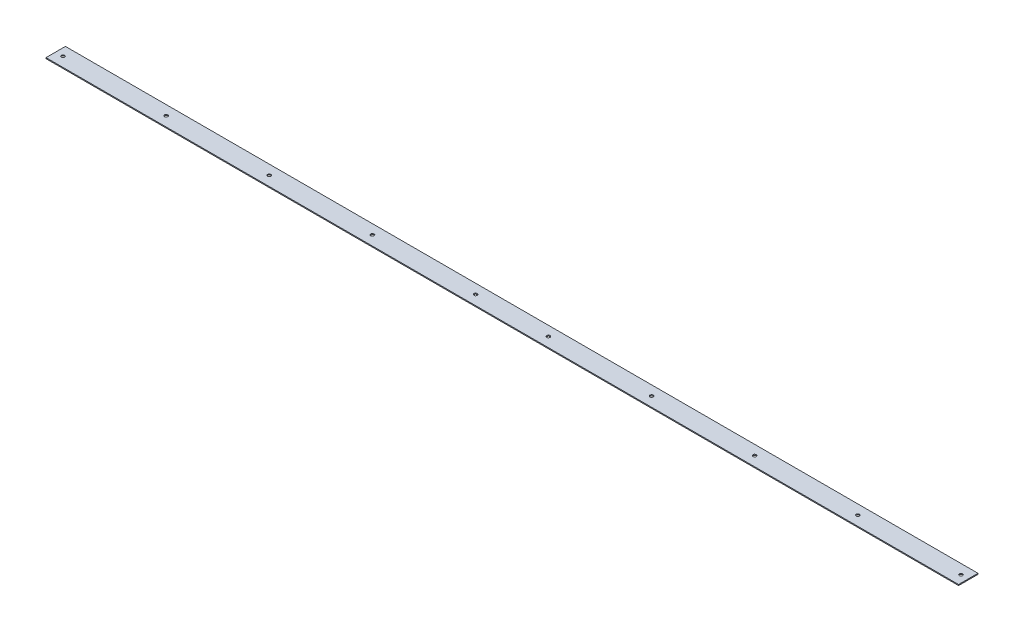
ISO-10303-21;
HEADER;
FILE_DESCRIPTION(('STEP AP214'),'2;1');
FILE_NAME('part.step','',(''),(''),'','','');
FILE_SCHEMA(('AUTOMOTIVE_DESIGN { 1 0 10303 214 1 1 1 1 }'));
ENDSEC;
DATA;
#1=APPLICATION_CONTEXT('core data for automotive mechanical design processes');
#2=APPLICATION_PROTOCOL_DEFINITION('international standard','automotive_design',2000,#1);
#3=PRODUCT_CONTEXT('',#1,'mechanical');
#4=PRODUCT('Part','Part','',(#3));
#5=PRODUCT_RELATED_PRODUCT_CATEGORY('part','',(#4));
#6=PRODUCT_DEFINITION_FORMATION('','',#4);
#7=PRODUCT_DEFINITION_CONTEXT('part definition',#1,'design');
#8=PRODUCT_DEFINITION('design','',#6,#7);
#9=PRODUCT_DEFINITION_SHAPE('','',#8);
#10=(LENGTH_UNIT() NAMED_UNIT(*) SI_UNIT(.MILLI.,.METRE.));
#11=(NAMED_UNIT(*) PLANE_ANGLE_UNIT() SI_UNIT($,.RADIAN.));
#12=(NAMED_UNIT(*) SI_UNIT($,.STERADIAN.) SOLID_ANGLE_UNIT());
#13=UNCERTAINTY_MEASURE_WITH_UNIT(LENGTH_MEASURE(1.E-05),#10,'distance_accuracy_value','');
#14=(GEOMETRIC_REPRESENTATION_CONTEXT(3) GLOBAL_UNCERTAINTY_ASSIGNED_CONTEXT((#13)) GLOBAL_UNIT_ASSIGNED_CONTEXT((#10,
#11,#12)) REPRESENTATION_CONTEXT('',''));
#15=CARTESIAN_POINT('',(0.,0.,0.));
#16=DIRECTION('',(0.,0.,1.));
#17=DIRECTION('',(1.,0.,0.));
#18=AXIS2_PLACEMENT_3D('',#15,#16,#17);
#19=CARTESIAN_POINT('',(-940.,2.,20.0000000000001));
#20=DIRECTION('',(1.,0.,0.));
#21=DIRECTION('',(0.,0.,-1.));
#22=AXIS2_PLACEMENT_3D('',#19,#20,#21);
#23=PLANE('',#22);
#24=DIRECTION('',(0.,0.,1.));
#25=VECTOR('',#24,1.);
#26=CARTESIAN_POINT('',(-940.,0.,20.0000000000001));
#27=LINE('',#26,#25);
#28=CARTESIAN_POINT('',(-940.,0.,-19.9999999999999));
#29=VERTEX_POINT('',#28);
#30=CARTESIAN_POINT('',(-940.,0.,20.0000000000001));
#31=VERTEX_POINT('',#30);
#32=EDGE_CURVE('E104',#29,#31,#27,.T.);
#33=ORIENTED_EDGE('',*,*,#32,.T.);
#34=DIRECTION('',(0.,-1.,0.));
#35=VECTOR('',#34,1.);
#36=CARTESIAN_POINT('',(-940.,2.,20.0000000000001));
#37=LINE('',#36,#35);
#38=CARTESIAN_POINT('',(-940.,2.,20.0000000000001));
#39=VERTEX_POINT('',#38);
#40=EDGE_CURVE('E11',#39,#31,#37,.T.);
#41=ORIENTED_EDGE('',*,*,#40,.F.);
#42=DIRECTION('',(0.,0.,1.));
#43=VECTOR('',#42,1.);
#44=CARTESIAN_POINT('',(-940.,2.,20.0000000000001));
#45=LINE('',#44,#43);
#46=CARTESIAN_POINT('',(-940.,2.,-19.9999999999999));
#47=VERTEX_POINT('',#46);
#48=EDGE_CURVE('E91',#47,#39,#45,.T.);
#49=ORIENTED_EDGE('',*,*,#48,.F.);
#50=DIRECTION('',(0.,-1.,0.));
#51=VECTOR('',#50,1.);
#52=CARTESIAN_POINT('',(-940.,2.,-19.9999999999999));
#53=LINE('',#52,#51);
#54=EDGE_CURVE('E100',#47,#29,#53,.T.);
#55=ORIENTED_EDGE('',*,*,#54,.T.);
#56=EDGE_LOOP('',(#33,#41,#49,#55));
#57=FACE_BOUND('',#56,.T.);
#58=ADVANCED_FACE('F38',(#57),#23,.F.);
#59=CARTESIAN_POINT('',(940.,2.,19.9999999999998));
#60=DIRECTION('',(0.,0.,-1.));
#61=DIRECTION('',(-1.,0.,0.));
#62=AXIS2_PLACEMENT_3D('',#59,#60,#61);
#63=PLANE('',#62);
#64=DIRECTION('',(1.,0.,0.));
#65=VECTOR('',#64,1.);
#66=CARTESIAN_POINT('',(940.,0.,19.9999999999998));
#67=LINE('',#66,#65);
#68=CARTESIAN_POINT('',(940.,0.,19.9999999999998));
#69=VERTEX_POINT('',#68);
#70=EDGE_CURVE('E95',#31,#69,#67,.T.);
#71=ORIENTED_EDGE('',*,*,#70,.T.);
#72=DIRECTION('',(0.,-1.,0.));
#73=VECTOR('',#72,1.);
#74=CARTESIAN_POINT('',(940.,2.,19.9999999999998));
#75=LINE('',#74,#73);
#76=CARTESIAN_POINT('',(940.,2.,19.9999999999998));
#77=VERTEX_POINT('',#76);
#78=EDGE_CURVE('E47',#77,#69,#75,.T.);
#79=ORIENTED_EDGE('',*,*,#78,.F.);
#80=DIRECTION('',(1.,0.,0.));
#81=VECTOR('',#80,1.);
#82=CARTESIAN_POINT('',(940.,2.,19.9999999999998));
#83=LINE('',#82,#81);
#84=EDGE_CURVE('E86',#39,#77,#83,.T.);
#85=ORIENTED_EDGE('',*,*,#84,.F.);
#86=ORIENTED_EDGE('',*,*,#40,.T.);
#87=EDGE_LOOP('',(#71,#79,#85,#86));
#88=FACE_BOUND('',#87,.T.);
#89=ADVANCED_FACE('F94',(#88),#63,.F.);
#90=CARTESIAN_POINT('',(940.,2.,19.9999999999998));
#91=DIRECTION('',(-1.,0.,0.));
#92=DIRECTION('',(0.,0.,1.));
#93=AXIS2_PLACEMENT_3D('',#90,#91,#92);
#94=PLANE('',#93);
#95=DIRECTION('',(0.,0.,-1.));
#96=VECTOR('',#95,1.);
#97=CARTESIAN_POINT('',(940.,0.,19.9999999999998));
#98=LINE('',#97,#96);
#99=CARTESIAN_POINT('',(940.,0.,-20.0000000000002));
#100=VERTEX_POINT('',#99);
#101=EDGE_CURVE('E73',#69,#100,#98,.T.);
#102=ORIENTED_EDGE('',*,*,#101,.T.);
#103=DIRECTION('',(0.,-1.,0.));
#104=VECTOR('',#103,1.);
#105=CARTESIAN_POINT('',(940.,2.,-20.0000000000002));
#106=LINE('',#105,#104);
#107=CARTESIAN_POINT('',(940.,2.,-20.0000000000002));
#108=VERTEX_POINT('',#107);
#109=EDGE_CURVE('E96',#108,#100,#106,.T.);
#110=ORIENTED_EDGE('',*,*,#109,.F.);
#111=DIRECTION('',(0.,0.,-1.));
#112=VECTOR('',#111,1.);
#113=CARTESIAN_POINT('',(940.,2.,19.9999999999998));
#114=LINE('',#113,#112);
#115=EDGE_CURVE('E89',#77,#108,#114,.T.);
#116=ORIENTED_EDGE('',*,*,#115,.F.);
#117=ORIENTED_EDGE('',*,*,#78,.T.);
#118=EDGE_LOOP('',(#102,#110,#116,#117));
#119=FACE_BOUND('',#118,.T.);
#120=ADVANCED_FACE('F98',(#119),#94,.F.);
#121=CARTESIAN_POINT('',(940.,2.,-20.0000000000002));
#122=DIRECTION('',(0.,0.,1.));
#123=DIRECTION('',(1.,0.,0.));
#124=AXIS2_PLACEMENT_3D('',#121,#122,#123);
#125=PLANE('',#124);
#126=DIRECTION('',(-1.,0.,0.));
#127=VECTOR('',#126,1.);
#128=CARTESIAN_POINT('',(940.,0.,-20.0000000000002));
#129=LINE('',#128,#127);
#130=EDGE_CURVE('E79',#100,#29,#129,.T.);
#131=ORIENTED_EDGE('',*,*,#130,.T.);
#132=ORIENTED_EDGE('',*,*,#54,.F.);
#133=DIRECTION('',(-1.,0.,0.));
#134=VECTOR('',#133,1.);
#135=CARTESIAN_POINT('',(940.,2.,-20.0000000000002));
#136=LINE('',#135,#134);
#137=EDGE_CURVE('E56',#108,#47,#136,.T.);
#138=ORIENTED_EDGE('',*,*,#137,.F.);
#139=ORIENTED_EDGE('',*,*,#109,.T.);
#140=EDGE_LOOP('',(#131,#132,#138,#139));
#141=FACE_BOUND('',#140,.T.);
#142=ADVANCED_FACE('F174',(#141),#125,.F.);
#143=CARTESIAN_POINT('',(0.,2.,0.));
#144=DIRECTION('',(0.,1.,0.));
#145=DIRECTION('',(0.,0.,1.));
#146=AXIS2_PLACEMENT_3D('',#143,#144,#145);
#147=PLANE('',#146);
#148=CARTESIAN_POINT('',(-925.,2.,0.));
#149=DIRECTION('',(0.,1.,0.));
#150=DIRECTION('',(0.,0.,1.));
#151=AXIS2_PLACEMENT_3D('',#148,#149,#150);
#152=CIRCLE('',#151,3.39999999999992);
#153=CARTESIAN_POINT('',(-925.,2.,3.39999999999999));
#154=VERTEX_POINT('',#153);
#155=EDGE_CURVE('E116',#154,#154,#152,.T.);
#156=ORIENTED_EDGE('',*,*,#155,.F.);
#157=EDGE_LOOP('',(#156));
#158=FACE_BOUND('',#157,.T.);
#159=CARTESIAN_POINT('',(74.9999999999996,2.,6.0049072150724E-12));
#160=DIRECTION('',(0.,1.,0.));
#161=DIRECTION('',(0.,0.,1.));
#162=AXIS2_PLACEMENT_3D('',#159,#160,#161);
#163=CIRCLE('',#162,3.4);
#164=CARTESIAN_POINT('',(74.9999999999996,2.,3.400000000006));
#165=VERTEX_POINT('',#164);
#166=EDGE_CURVE('E314',#165,#165,#163,.T.);
#167=ORIENTED_EDGE('',*,*,#166,.F.);
#168=EDGE_LOOP('',(#167));
#169=FACE_BOUND('',#168,.T.);
#170=CARTESIAN_POINT('',(287.5,2.,4.52102764606407E-12));
#171=DIRECTION('',(0.,1.,0.));
#172=DIRECTION('',(0.,0.,1.));
#173=AXIS2_PLACEMENT_3D('',#170,#171,#172);
#174=CIRCLE('',#173,3.40000000000003);
#175=CARTESIAN_POINT('',(287.5,2.,3.40000000000455));
#176=VERTEX_POINT('',#175);
#177=EDGE_CURVE('E288',#176,#176,#174,.T.);
#178=ORIENTED_EDGE('',*,*,#177,.F.);
#179=EDGE_LOOP('',(#178));
#180=FACE_BOUND('',#179,.T.);
#181=CARTESIAN_POINT('',(500.,2.,3.03714807705574E-12));
#182=DIRECTION('',(0.,1.,0.));
#183=DIRECTION('',(0.,0.,1.));
#184=AXIS2_PLACEMENT_3D('',#181,#182,#183);
#185=CIRCLE('',#184,3.39999999999997);
#186=CARTESIAN_POINT('',(500.,2.,3.40000000000301));
#187=VERTEX_POINT('',#186);
#188=EDGE_CURVE('E313',#187,#187,#185,.T.);
#189=ORIENTED_EDGE('',*,*,#188,.F.);
#190=EDGE_LOOP('',(#189));
#191=FACE_BOUND('',#190,.T.);
#192=CARTESIAN_POINT('',(712.5,2.,1.5532685080474E-12));
#193=DIRECTION('',(0.,1.,0.));
#194=DIRECTION('',(0.,0.,1.));
#195=AXIS2_PLACEMENT_3D('',#192,#193,#194);
#196=CIRCLE('',#195,3.39999999999992);
#197=CARTESIAN_POINT('',(712.5,2.,3.40000000000147));
#198=VERTEX_POINT('',#197);
#199=EDGE_CURVE('E317',#198,#198,#196,.T.);
#200=ORIENTED_EDGE('',*,*,#199,.F.);
#201=EDGE_LOOP('',(#200));
#202=FACE_BOUND('',#201,.T.);
#203=CARTESIAN_POINT('',(925.,2.,0.));
#204=DIRECTION('',(0.,1.,0.));
#205=DIRECTION('',(0.,0.,1.));
#206=AXIS2_PLACEMENT_3D('',#203,#204,#205);
#207=CIRCLE('',#206,3.39999999999992);
#208=CARTESIAN_POINT('',(925.,2.,3.39999999999999));
#209=VERTEX_POINT('',#208);
#210=EDGE_CURVE('E324',#209,#209,#207,.T.);
#211=ORIENTED_EDGE('',*,*,#210,.F.);
#212=EDGE_LOOP('',(#211));
#213=FACE_BOUND('',#212,.T.);
#214=CARTESIAN_POINT('',(-75.0000000000002,2.,0.));
#215=DIRECTION('',(0.,1.,0.));
#216=DIRECTION('',(0.,0.,1.));
#217=AXIS2_PLACEMENT_3D('',#214,#215,#216);
#218=CIRCLE('',#217,3.4);
#219=CARTESIAN_POINT('',(-75.0000000000002,2.,3.40000000000007));
#220=VERTEX_POINT('',#219);
#221=EDGE_CURVE('E327',#220,#220,#218,.T.);
#222=ORIENTED_EDGE('',*,*,#221,.F.);
#223=EDGE_LOOP('',(#222));
#224=FACE_BOUND('',#223,.T.);
#225=CARTESIAN_POINT('',(-287.5,2.,0.));
#226=DIRECTION('',(0.,1.,0.));
#227=DIRECTION('',(0.,0.,1.));
#228=AXIS2_PLACEMENT_3D('',#225,#226,#227);
#229=CIRCLE('',#228,3.40000000000003);
#230=CARTESIAN_POINT('',(-287.5,2.,3.4000000000001));
#231=VERTEX_POINT('',#230);
#232=EDGE_CURVE('E330',#231,#231,#229,.T.);
#233=ORIENTED_EDGE('',*,*,#232,.F.);
#234=EDGE_LOOP('',(#233));
#235=FACE_BOUND('',#234,.T.);
#236=CARTESIAN_POINT('',(-500.,2.,0.));
#237=DIRECTION('',(0.,1.,0.));
#238=DIRECTION('',(0.,0.,1.));
#239=AXIS2_PLACEMENT_3D('',#236,#237,#238);
#240=CIRCLE('',#239,3.40000000000003);
#241=CARTESIAN_POINT('',(-500.,2.,3.4000000000001));
#242=VERTEX_POINT('',#241);
#243=EDGE_CURVE('E333',#242,#242,#240,.T.);
#244=ORIENTED_EDGE('',*,*,#243,.F.);
#245=EDGE_LOOP('',(#244));
#246=FACE_BOUND('',#245,.T.);
#247=CARTESIAN_POINT('',(-712.5,2.,0.));
#248=DIRECTION('',(0.,1.,0.));
#249=DIRECTION('',(0.,0.,1.));
#250=AXIS2_PLACEMENT_3D('',#247,#248,#249);
#251=CIRCLE('',#250,3.39999999999992);
#252=CARTESIAN_POINT('',(-712.5,2.,3.39999999999999));
#253=VERTEX_POINT('',#252);
#254=EDGE_CURVE('E336',#253,#253,#251,.T.);
#255=ORIENTED_EDGE('',*,*,#254,.F.);
#256=EDGE_LOOP('',(#255));
#257=FACE_BOUND('',#256,.T.);
#258=ORIENTED_EDGE('',*,*,#48,.T.);
#259=ORIENTED_EDGE('',*,*,#84,.T.);
#260=ORIENTED_EDGE('',*,*,#115,.T.);
#261=ORIENTED_EDGE('',*,*,#137,.T.);
#262=EDGE_LOOP('',(#258,#259,#260,#261));
#263=FACE_BOUND('',#262,.T.);
#264=ADVANCED_FACE('F87',(#158,#169,#180,#191,#202,#213,#224,#235,#246,#257,#263),#147,.T.);
#265=CARTESIAN_POINT('',(0.,0.,0.));
#266=DIRECTION('',(0.,1.,0.));
#267=DIRECTION('',(0.,0.,1.));
#268=AXIS2_PLACEMENT_3D('',#265,#266,#267);
#269=PLANE('',#268);
#270=CARTESIAN_POINT('',(-925.,0.,0.));
#271=DIRECTION('',(0.,1.,0.));
#272=DIRECTION('',(0.,0.,1.));
#273=AXIS2_PLACEMENT_3D('',#270,#271,#272);
#274=CIRCLE('',#273,3.39999999999992);
#275=CARTESIAN_POINT('',(-925.,0.,3.39999999999999));
#276=VERTEX_POINT('',#275);
#277=EDGE_CURVE('E41',#276,#276,#274,.T.);
#278=ORIENTED_EDGE('',*,*,#277,.T.);
#279=EDGE_LOOP('',(#278));
#280=FACE_BOUND('',#279,.T.);
#281=CARTESIAN_POINT('',(74.9999999999996,0.,6.0049072150724E-12));
#282=DIRECTION('',(0.,1.,0.));
#283=DIRECTION('',(0.,0.,1.));
#284=AXIS2_PLACEMENT_3D('',#281,#282,#283);
#285=CIRCLE('',#284,3.4);
#286=CARTESIAN_POINT('',(74.9999999999996,0.,3.400000000006));
#287=VERTEX_POINT('',#286);
#288=EDGE_CURVE('E136',#287,#287,#285,.T.);
#289=ORIENTED_EDGE('',*,*,#288,.T.);
#290=EDGE_LOOP('',(#289));
#291=FACE_BOUND('',#290,.T.);
#292=CARTESIAN_POINT('',(287.5,0.,4.52102764606407E-12));
#293=DIRECTION('',(0.,1.,0.));
#294=DIRECTION('',(0.,0.,1.));
#295=AXIS2_PLACEMENT_3D('',#292,#293,#294);
#296=CIRCLE('',#295,3.40000000000003);
#297=CARTESIAN_POINT('',(287.5,0.,3.40000000000455));
#298=VERTEX_POINT('',#297);
#299=EDGE_CURVE('E134',#298,#298,#296,.T.);
#300=ORIENTED_EDGE('',*,*,#299,.T.);
#301=EDGE_LOOP('',(#300));
#302=FACE_BOUND('',#301,.T.);
#303=CARTESIAN_POINT('',(500.,0.,3.03714807705574E-12));
#304=DIRECTION('',(0.,1.,0.));
#305=DIRECTION('',(0.,0.,1.));
#306=AXIS2_PLACEMENT_3D('',#303,#304,#305);
#307=CIRCLE('',#306,3.39999999999997);
#308=CARTESIAN_POINT('',(500.,0.,3.40000000000301));
#309=VERTEX_POINT('',#308);
#310=EDGE_CURVE('E131',#309,#309,#307,.T.);
#311=ORIENTED_EDGE('',*,*,#310,.T.);
#312=EDGE_LOOP('',(#311));
#313=FACE_BOUND('',#312,.T.);
#314=CARTESIAN_POINT('',(712.5,0.,1.5532685080474E-12));
#315=DIRECTION('',(0.,1.,0.));
#316=DIRECTION('',(0.,0.,1.));
#317=AXIS2_PLACEMENT_3D('',#314,#315,#316);
#318=CIRCLE('',#317,3.39999999999992);
#319=CARTESIAN_POINT('',(712.5,0.,3.40000000000147));
#320=VERTEX_POINT('',#319);
#321=EDGE_CURVE('E128',#320,#320,#318,.T.);
#322=ORIENTED_EDGE('',*,*,#321,.T.);
#323=EDGE_LOOP('',(#322));
#324=FACE_BOUND('',#323,.T.);
#325=CARTESIAN_POINT('',(925.,0.,0.));
#326=DIRECTION('',(0.,1.,0.));
#327=DIRECTION('',(0.,0.,1.));
#328=AXIS2_PLACEMENT_3D('',#325,#326,#327);
#329=CIRCLE('',#328,3.39999999999992);
#330=CARTESIAN_POINT('',(925.,0.,3.39999999999999));
#331=VERTEX_POINT('',#330);
#332=EDGE_CURVE('E125',#331,#331,#329,.T.);
#333=ORIENTED_EDGE('',*,*,#332,.T.);
#334=EDGE_LOOP('',(#333));
#335=FACE_BOUND('',#334,.T.);
#336=CARTESIAN_POINT('',(-75.0000000000002,0.,0.));
#337=DIRECTION('',(0.,1.,0.));
#338=DIRECTION('',(0.,0.,1.));
#339=AXIS2_PLACEMENT_3D('',#336,#337,#338);
#340=CIRCLE('',#339,3.4);
#341=CARTESIAN_POINT('',(-75.0000000000002,0.,3.40000000000007));
#342=VERTEX_POINT('',#341);
#343=EDGE_CURVE('E122',#342,#342,#340,.T.);
#344=ORIENTED_EDGE('',*,*,#343,.T.);
#345=EDGE_LOOP('',(#344));
#346=FACE_BOUND('',#345,.T.);
#347=CARTESIAN_POINT('',(-287.5,0.,0.));
#348=DIRECTION('',(0.,1.,0.));
#349=DIRECTION('',(0.,0.,1.));
#350=AXIS2_PLACEMENT_3D('',#347,#348,#349);
#351=CIRCLE('',#350,3.40000000000003);
#352=CARTESIAN_POINT('',(-287.5,0.,3.4000000000001));
#353=VERTEX_POINT('',#352);
#354=EDGE_CURVE('E119',#353,#353,#351,.T.);
#355=ORIENTED_EDGE('',*,*,#354,.T.);
#356=EDGE_LOOP('',(#355));
#357=FACE_BOUND('',#356,.T.);
#358=CARTESIAN_POINT('',(-500.,0.,0.));
#359=DIRECTION('',(0.,1.,0.));
#360=DIRECTION('',(0.,0.,1.));
#361=AXIS2_PLACEMENT_3D('',#358,#359,#360);
#362=CIRCLE('',#361,3.40000000000003);
#363=CARTESIAN_POINT('',(-500.,0.,3.4000000000001));
#364=VERTEX_POINT('',#363);
#365=EDGE_CURVE('E115',#364,#364,#362,.T.);
#366=ORIENTED_EDGE('',*,*,#365,.T.);
#367=EDGE_LOOP('',(#366));
#368=FACE_BOUND('',#367,.T.);
#369=CARTESIAN_POINT('',(-712.5,0.,0.));
#370=DIRECTION('',(0.,1.,0.));
#371=DIRECTION('',(0.,0.,1.));
#372=AXIS2_PLACEMENT_3D('',#369,#370,#371);
#373=CIRCLE('',#372,3.39999999999992);
#374=CARTESIAN_POINT('',(-712.5,0.,3.39999999999999));
#375=VERTEX_POINT('',#374);
#376=EDGE_CURVE('E112',#375,#375,#373,.T.);
#377=ORIENTED_EDGE('',*,*,#376,.T.);
#378=EDGE_LOOP('',(#377));
#379=FACE_BOUND('',#378,.T.);
#380=ORIENTED_EDGE('',*,*,#32,.F.);
#381=ORIENTED_EDGE('',*,*,#130,.F.);
#382=ORIENTED_EDGE('',*,*,#101,.F.);
#383=ORIENTED_EDGE('',*,*,#70,.F.);
#384=EDGE_LOOP('',(#380,#381,#382,#383));
#385=FACE_BOUND('',#384,.T.);
#386=ADVANCED_FACE('F143',(#280,#291,#302,#313,#324,#335,#346,#357,#368,#379,#385),#269,.F.);
#387=CARTESIAN_POINT('',(-712.5,-8.,0.));
#388=DIRECTION('',(0.,1.,0.));
#389=DIRECTION('',(0.,0.,1.));
#390=AXIS2_PLACEMENT_3D('',#387,#388,#389);
#391=CYLINDRICAL_SURFACE('',#390,3.39999999999992);
#392=ORIENTED_EDGE('',*,*,#254,.T.);
#393=EDGE_LOOP('',(#392));
#394=FACE_BOUND('',#393,.T.);
#395=ORIENTED_EDGE('',*,*,#376,.F.);
#396=EDGE_LOOP('',(#395));
#397=FACE_BOUND('',#396,.T.);
#398=ADVANCED_FACE('F165',(#394,#397),#391,.F.);
#399=CARTESIAN_POINT('',(-500.,-8.,0.));
#400=DIRECTION('',(0.,1.,0.));
#401=DIRECTION('',(0.,0.,1.));
#402=AXIS2_PLACEMENT_3D('',#399,#400,#401);
#403=CYLINDRICAL_SURFACE('',#402,3.40000000000003);
#404=ORIENTED_EDGE('',*,*,#243,.T.);
#405=EDGE_LOOP('',(#404));
#406=FACE_BOUND('',#405,.T.);
#407=ORIENTED_EDGE('',*,*,#365,.F.);
#408=EDGE_LOOP('',(#407));
#409=FACE_BOUND('',#408,.T.);
#410=ADVANCED_FACE('F171',(#406,#409),#403,.F.);
#411=CARTESIAN_POINT('',(-287.5,-8.,0.));
#412=DIRECTION('',(0.,1.,0.));
#413=DIRECTION('',(0.,0.,1.));
#414=AXIS2_PLACEMENT_3D('',#411,#412,#413);
#415=CYLINDRICAL_SURFACE('',#414,3.40000000000003);
#416=ORIENTED_EDGE('',*,*,#232,.T.);
#417=EDGE_LOOP('',(#416));
#418=FACE_BOUND('',#417,.T.);
#419=ORIENTED_EDGE('',*,*,#354,.F.);
#420=EDGE_LOOP('',(#419));
#421=FACE_BOUND('',#420,.T.);
#422=ADVANCED_FACE('F213',(#418,#421),#415,.F.);
#423=CARTESIAN_POINT('',(-75.0000000000002,-8.,0.));
#424=DIRECTION('',(0.,1.,0.));
#425=DIRECTION('',(0.,0.,1.));
#426=AXIS2_PLACEMENT_3D('',#423,#424,#425);
#427=CYLINDRICAL_SURFACE('',#426,3.4);
#428=ORIENTED_EDGE('',*,*,#221,.T.);
#429=EDGE_LOOP('',(#428));
#430=FACE_BOUND('',#429,.T.);
#431=ORIENTED_EDGE('',*,*,#343,.F.);
#432=EDGE_LOOP('',(#431));
#433=FACE_BOUND('',#432,.T.);
#434=ADVANCED_FACE('F223',(#430,#433),#427,.F.);
#435=CARTESIAN_POINT('',(925.,-8.,0.));
#436=DIRECTION('',(0.,1.,0.));
#437=DIRECTION('',(0.,0.,1.));
#438=AXIS2_PLACEMENT_3D('',#435,#436,#437);
#439=CYLINDRICAL_SURFACE('',#438,3.39999999999992);
#440=ORIENTED_EDGE('',*,*,#210,.T.);
#441=EDGE_LOOP('',(#440));
#442=FACE_BOUND('',#441,.T.);
#443=ORIENTED_EDGE('',*,*,#332,.F.);
#444=EDGE_LOOP('',(#443));
#445=FACE_BOUND('',#444,.T.);
#446=ADVANCED_FACE('F233',(#442,#445),#439,.F.);
#447=CARTESIAN_POINT('',(712.5,-8.,1.5532685080474E-12));
#448=DIRECTION('',(0.,1.,0.));
#449=DIRECTION('',(0.,0.,1.));
#450=AXIS2_PLACEMENT_3D('',#447,#448,#449);
#451=CYLINDRICAL_SURFACE('',#450,3.39999999999992);
#452=ORIENTED_EDGE('',*,*,#199,.T.);
#453=EDGE_LOOP('',(#452));
#454=FACE_BOUND('',#453,.T.);
#455=ORIENTED_EDGE('',*,*,#321,.F.);
#456=EDGE_LOOP('',(#455));
#457=FACE_BOUND('',#456,.T.);
#458=ADVANCED_FACE('F243',(#454,#457),#451,.F.);
#459=CARTESIAN_POINT('',(500.,-8.,3.03714807705574E-12));
#460=DIRECTION('',(0.,1.,0.));
#461=DIRECTION('',(0.,0.,1.));
#462=AXIS2_PLACEMENT_3D('',#459,#460,#461);
#463=CYLINDRICAL_SURFACE('',#462,3.39999999999997);
#464=ORIENTED_EDGE('',*,*,#188,.T.);
#465=EDGE_LOOP('',(#464));
#466=FACE_BOUND('',#465,.T.);
#467=ORIENTED_EDGE('',*,*,#310,.F.);
#468=EDGE_LOOP('',(#467));
#469=FACE_BOUND('',#468,.T.);
#470=ADVANCED_FACE('F253',(#466,#469),#463,.F.);
#471=CARTESIAN_POINT('',(287.5,-8.,4.52102764606407E-12));
#472=DIRECTION('',(0.,1.,0.));
#473=DIRECTION('',(0.,0.,1.));
#474=AXIS2_PLACEMENT_3D('',#471,#472,#473);
#475=CYLINDRICAL_SURFACE('',#474,3.40000000000003);
#476=ORIENTED_EDGE('',*,*,#177,.T.);
#477=EDGE_LOOP('',(#476));
#478=FACE_BOUND('',#477,.T.);
#479=ORIENTED_EDGE('',*,*,#299,.F.);
#480=EDGE_LOOP('',(#479));
#481=FACE_BOUND('',#480,.T.);
#482=ADVANCED_FACE('F153',(#478,#481),#475,.F.);
#483=CARTESIAN_POINT('',(74.9999999999996,-8.,6.0049072150724E-12));
#484=DIRECTION('',(0.,1.,0.));
#485=DIRECTION('',(0.,0.,1.));
#486=AXIS2_PLACEMENT_3D('',#483,#484,#485);
#487=CYLINDRICAL_SURFACE('',#486,3.4);
#488=ORIENTED_EDGE('',*,*,#166,.T.);
#489=EDGE_LOOP('',(#488));
#490=FACE_BOUND('',#489,.T.);
#491=ORIENTED_EDGE('',*,*,#288,.F.);
#492=EDGE_LOOP('',(#491));
#493=FACE_BOUND('',#492,.T.);
#494=ADVANCED_FACE('F147',(#490,#493),#487,.F.);
#495=CARTESIAN_POINT('',(-925.,-8.,0.));
#496=DIRECTION('',(0.,1.,0.));
#497=DIRECTION('',(0.,0.,1.));
#498=AXIS2_PLACEMENT_3D('',#495,#496,#497);
#499=CYLINDRICAL_SURFACE('',#498,3.39999999999992);
#500=ORIENTED_EDGE('',*,*,#155,.T.);
#501=EDGE_LOOP('',(#500));
#502=FACE_BOUND('',#501,.T.);
#503=ORIENTED_EDGE('',*,*,#277,.F.);
#504=EDGE_LOOP('',(#503));
#505=FACE_BOUND('',#504,.T.);
#506=ADVANCED_FACE('F145',(#502,#505),#499,.F.);
#507=CLOSED_SHELL('',(#58,#89,#120,#142,#264,#386,#398,#410,#422,#434,#446,#458,#470,#482,#494,#506));
#508=MANIFOLD_SOLID_BREP('B2',#507);
#509=ADVANCED_BREP_SHAPE_REPRESENTATION('',(#18,#508),#14);
#510=SHAPE_DEFINITION_REPRESENTATION(#9,#509);
ENDSEC;
END-ISO-10303-21;
